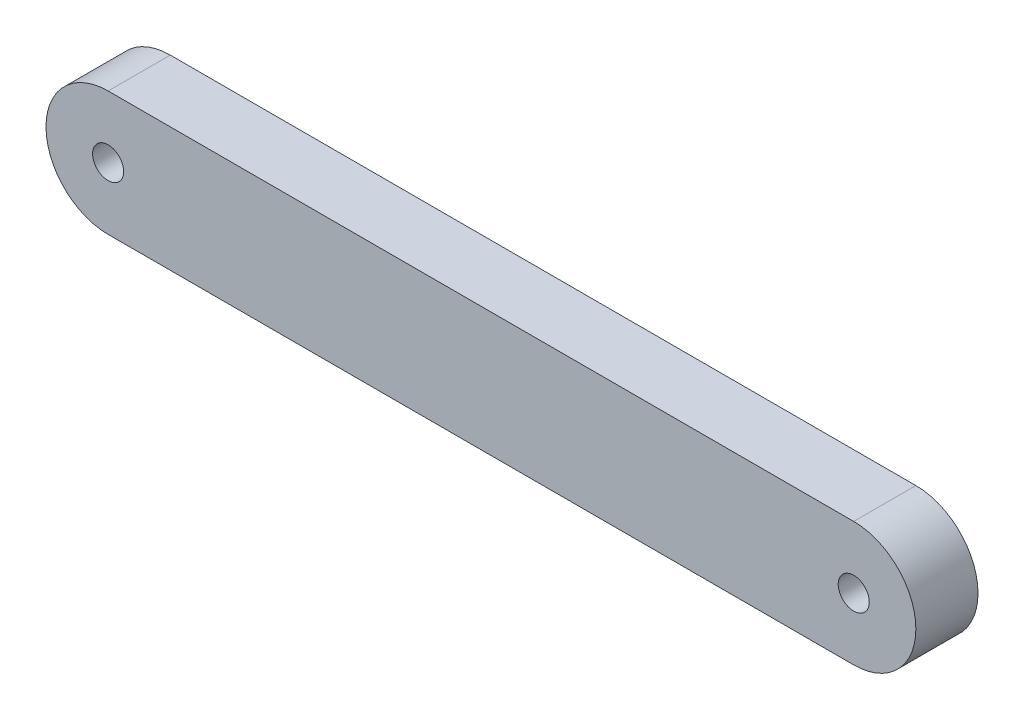
ISO-10303-21;
HEADER;
FILE_DESCRIPTION(('STEP AP214'),'2;1');
FILE_NAME('part.step','',(''),(''),'','','');
FILE_SCHEMA(('AUTOMOTIVE_DESIGN { 1 0 10303 214 1 1 1 1 }'));
ENDSEC;
DATA;
#1=APPLICATION_CONTEXT('core data for automotive mechanical design processes');
#2=APPLICATION_PROTOCOL_DEFINITION('international standard','automotive_design',2000,#1);
#3=PRODUCT_CONTEXT('',#1,'mechanical');
#4=PRODUCT('Part','Part','',(#3));
#5=PRODUCT_RELATED_PRODUCT_CATEGORY('part','',(#4));
#6=PRODUCT_DEFINITION_FORMATION('','',#4);
#7=PRODUCT_DEFINITION_CONTEXT('part definition',#1,'design');
#8=PRODUCT_DEFINITION('design','',#6,#7);
#9=PRODUCT_DEFINITION_SHAPE('','',#8);
#10=(LENGTH_UNIT() NAMED_UNIT(*) SI_UNIT(.MILLI.,.METRE.));
#11=(NAMED_UNIT(*) PLANE_ANGLE_UNIT() SI_UNIT($,.RADIAN.));
#12=(NAMED_UNIT(*) SI_UNIT($,.STERADIAN.) SOLID_ANGLE_UNIT());
#13=UNCERTAINTY_MEASURE_WITH_UNIT(LENGTH_MEASURE(1.E-05),#10,'distance_accuracy_value','');
#14=(GEOMETRIC_REPRESENTATION_CONTEXT(3) GLOBAL_UNCERTAINTY_ASSIGNED_CONTEXT((#13)) GLOBAL_UNIT_ASSIGNED_CONTEXT((#10,
#11,#12)) REPRESENTATION_CONTEXT('',''));
#15=CARTESIAN_POINT('',(0.,0.,0.));
#16=DIRECTION('',(0.,0.,1.));
#17=DIRECTION('',(1.,0.,0.));
#18=AXIS2_PLACEMENT_3D('',#15,#16,#17);
#19=CARTESIAN_POINT('',(0.,-6.35,6.35));
#20=DIRECTION('',(0.,1.,0.));
#21=DIRECTION('',(-1.,0.,0.));
#22=AXIS2_PLACEMENT_3D('',#19,#20,#21);
#23=PLANE('',#22);
#24=DIRECTION('',(1.,0.,0.));
#25=VECTOR('',#24,1.);
#26=CARTESIAN_POINT('',(0.,-6.35,0.));
#27=LINE('',#26,#25);
#28=CARTESIAN_POINT('',(0.,-6.35,0.));
#29=VERTEX_POINT('',#28);
#30=CARTESIAN_POINT('',(76.2,-6.34999999999999,0.));
#31=VERTEX_POINT('',#30);
#32=EDGE_CURVE('E104',#29,#31,#27,.T.);
#33=ORIENTED_EDGE('',*,*,#32,.T.);
#34=DIRECTION('',(0.,0.,-1.));
#35=VECTOR('',#34,1.);
#36=CARTESIAN_POINT('',(76.2,-6.34999999999999,6.35));
#37=LINE('',#36,#35);
#38=CARTESIAN_POINT('',(76.2,-6.34999999999999,6.35));
#39=VERTEX_POINT('',#38);
#40=EDGE_CURVE('E11',#39,#31,#37,.T.);
#41=ORIENTED_EDGE('',*,*,#40,.F.);
#42=DIRECTION('',(1.,0.,0.));
#43=VECTOR('',#42,1.);
#44=CARTESIAN_POINT('',(0.,-6.35,6.35));
#45=LINE('',#44,#43);
#46=CARTESIAN_POINT('',(0.,-6.35,6.35));
#47=VERTEX_POINT('',#46);
#48=EDGE_CURVE('E83',#47,#39,#45,.T.);
#49=ORIENTED_EDGE('',*,*,#48,.F.);
#50=DIRECTION('',(0.,0.,-1.));
#51=VECTOR('',#50,1.);
#52=CARTESIAN_POINT('',(0.,-6.35,6.35));
#53=LINE('',#52,#51);
#54=EDGE_CURVE('E103',#47,#29,#53,.T.);
#55=ORIENTED_EDGE('',*,*,#54,.T.);
#56=EDGE_LOOP('',(#33,#41,#49,#55));
#57=FACE_BOUND('',#56,.T.);
#58=ADVANCED_FACE('F35',(#57),#23,.F.);
#59=CARTESIAN_POINT('',(76.2,0.,6.35));
#60=DIRECTION('',(0.,0.,-1.));
#61=DIRECTION('',(-1.,0.,0.));
#62=AXIS2_PLACEMENT_3D('',#59,#60,#61);
#63=CYLINDRICAL_SURFACE('',#62,6.35);
#64=CARTESIAN_POINT('',(76.2,0.,0.));
#65=DIRECTION('',(0.,0.,1.));
#66=DIRECTION('',(1.,0.,0.));
#67=AXIS2_PLACEMENT_3D('',#64,#65,#66);
#68=CIRCLE('',#67,6.35);
#69=CARTESIAN_POINT('',(76.2,6.35,0.));
#70=VERTEX_POINT('',#69);
#71=EDGE_CURVE('E88',#31,#70,#68,.T.);
#72=ORIENTED_EDGE('',*,*,#71,.T.);
#73=DIRECTION('',(0.,0.,-1.));
#74=VECTOR('',#73,1.);
#75=CARTESIAN_POINT('',(76.2,6.35,6.35));
#76=LINE('',#75,#74);
#77=CARTESIAN_POINT('',(76.2,6.35,6.35));
#78=VERTEX_POINT('',#77);
#79=EDGE_CURVE('E43',#78,#70,#76,.T.);
#80=ORIENTED_EDGE('',*,*,#79,.F.);
#81=CARTESIAN_POINT('',(76.2,0.,6.35));
#82=DIRECTION('',(0.,0.,1.));
#83=DIRECTION('',(1.,0.,0.));
#84=AXIS2_PLACEMENT_3D('',#81,#82,#83);
#85=CIRCLE('',#84,6.35);
#86=EDGE_CURVE('E77',#39,#78,#85,.T.);
#87=ORIENTED_EDGE('',*,*,#86,.F.);
#88=ORIENTED_EDGE('',*,*,#40,.T.);
#89=EDGE_LOOP('',(#72,#80,#87,#88));
#90=FACE_BOUND('',#89,.T.);
#91=ADVANCED_FACE('F87',(#90),#63,.T.);
#92=CARTESIAN_POINT('',(0.,6.35,6.35));
#93=DIRECTION('',(0.,1.,0.));
#94=DIRECTION('',(-1.,0.,0.));
#95=AXIS2_PLACEMENT_3D('',#92,#93,#94);
#96=PLANE('',#95);
#97=DIRECTION('',(1.,0.,0.));
#98=VECTOR('',#97,1.);
#99=CARTESIAN_POINT('',(0.,6.35,0.));
#100=LINE('',#99,#98);
#101=CARTESIAN_POINT('',(0.,6.35,0.));
#102=VERTEX_POINT('',#101);
#103=EDGE_CURVE('E108',#102,#70,#100,.T.);
#104=ORIENTED_EDGE('',*,*,#103,.F.);
#105=DIRECTION('',(0.,0.,-1.));
#106=VECTOR('',#105,1.);
#107=CARTESIAN_POINT('',(0.,6.35,6.35));
#108=LINE('',#107,#106);
#109=CARTESIAN_POINT('',(0.,6.35,6.35));
#110=VERTEX_POINT('',#109);
#111=EDGE_CURVE('E67',#110,#102,#108,.T.);
#112=ORIENTED_EDGE('',*,*,#111,.F.);
#113=DIRECTION('',(1.,0.,0.));
#114=VECTOR('',#113,1.);
#115=CARTESIAN_POINT('',(0.,6.35,6.35));
#116=LINE('',#115,#114);
#117=EDGE_CURVE('E81',#110,#78,#116,.T.);
#118=ORIENTED_EDGE('',*,*,#117,.T.);
#119=ORIENTED_EDGE('',*,*,#79,.T.);
#120=EDGE_LOOP('',(#104,#112,#118,#119));
#121=FACE_BOUND('',#120,.T.);
#122=ADVANCED_FACE('F92',(#121),#96,.T.);
#123=CARTESIAN_POINT('',(0.,0.,6.35));
#124=DIRECTION('',(0.,0.,-1.));
#125=DIRECTION('',(-1.,0.,0.));
#126=AXIS2_PLACEMENT_3D('',#123,#124,#125);
#127=CYLINDRICAL_SURFACE('',#126,1.5875);
#128=CARTESIAN_POINT('',(0.,0.,6.35));
#129=DIRECTION('',(0.,0.,1.));
#130=DIRECTION('',(1.,0.,0.));
#131=AXIS2_PLACEMENT_3D('',#128,#129,#130);
#132=CIRCLE('',#131,1.5875);
#133=CARTESIAN_POINT('',(1.5875,0.,6.35));
#134=VERTEX_POINT('',#133);
#135=EDGE_CURVE('E94',#134,#134,#132,.T.);
#136=ORIENTED_EDGE('',*,*,#135,.T.);
#137=EDGE_LOOP('',(#136));
#138=FACE_BOUND('',#137,.T.);
#139=CARTESIAN_POINT('',(0.,0.,0.));
#140=DIRECTION('',(0.,0.,1.));
#141=DIRECTION('',(1.,0.,0.));
#142=AXIS2_PLACEMENT_3D('',#139,#140,#141);
#143=CIRCLE('',#142,1.5875);
#144=CARTESIAN_POINT('',(1.5875,0.,0.));
#145=VERTEX_POINT('',#144);
#146=EDGE_CURVE('E111',#145,#145,#143,.T.);
#147=ORIENTED_EDGE('',*,*,#146,.F.);
#148=EDGE_LOOP('',(#147));
#149=FACE_BOUND('',#148,.T.);
#150=ADVANCED_FACE('F139',(#138,#149),#127,.F.);
#151=CARTESIAN_POINT('',(0.,0.,6.35));
#152=DIRECTION('',(0.,0.,-1.));
#153=DIRECTION('',(-1.,0.,0.));
#154=AXIS2_PLACEMENT_3D('',#151,#152,#153);
#155=CYLINDRICAL_SURFACE('',#154,6.35);
#156=CARTESIAN_POINT('',(0.,0.,0.));
#157=DIRECTION('',(0.,0.,1.));
#158=DIRECTION('',(1.,0.,0.));
#159=AXIS2_PLACEMENT_3D('',#156,#157,#158);
#160=CIRCLE('',#159,6.35);
#161=EDGE_CURVE('E70',#102,#29,#160,.T.);
#162=ORIENTED_EDGE('',*,*,#161,.T.);
#163=ORIENTED_EDGE('',*,*,#54,.F.);
#164=CARTESIAN_POINT('',(0.,0.,6.35));
#165=DIRECTION('',(0.,0.,1.));
#166=DIRECTION('',(1.,0.,0.));
#167=AXIS2_PLACEMENT_3D('',#164,#165,#166);
#168=CIRCLE('',#167,6.35);
#169=EDGE_CURVE('E51',#110,#47,#168,.T.);
#170=ORIENTED_EDGE('',*,*,#169,.F.);
#171=ORIENTED_EDGE('',*,*,#111,.T.);
#172=EDGE_LOOP('',(#162,#163,#170,#171));
#173=FACE_BOUND('',#172,.T.);
#174=ADVANCED_FACE('F131',(#173),#155,.T.);
#175=CARTESIAN_POINT('',(76.2,0.,6.35));
#176=DIRECTION('',(0.,0.,-1.));
#177=DIRECTION('',(-1.,0.,0.));
#178=AXIS2_PLACEMENT_3D('',#175,#176,#177);
#179=CYLINDRICAL_SURFACE('',#178,1.5875);
#180=CARTESIAN_POINT('',(76.2,0.,6.35));
#181=DIRECTION('',(0.,0.,1.));
#182=DIRECTION('',(1.,0.,0.));
#183=AXIS2_PLACEMENT_3D('',#180,#181,#182);
#184=CIRCLE('',#183,1.5875);
#185=CARTESIAN_POINT('',(77.7875,0.,6.35));
#186=VERTEX_POINT('',#185);
#187=EDGE_CURVE('E100',#186,#186,#184,.T.);
#188=ORIENTED_EDGE('',*,*,#187,.T.);
#189=EDGE_LOOP('',(#188));
#190=FACE_BOUND('',#189,.T.);
#191=CARTESIAN_POINT('',(76.2,0.,0.));
#192=DIRECTION('',(0.,0.,1.));
#193=DIRECTION('',(1.,0.,0.));
#194=AXIS2_PLACEMENT_3D('',#191,#192,#193);
#195=CIRCLE('',#194,1.5875);
#196=CARTESIAN_POINT('',(77.7875,0.,0.));
#197=VERTEX_POINT('',#196);
#198=EDGE_CURVE('E114',#197,#197,#195,.T.);
#199=ORIENTED_EDGE('',*,*,#198,.F.);
#200=EDGE_LOOP('',(#199));
#201=FACE_BOUND('',#200,.T.);
#202=ADVANCED_FACE('F129',(#190,#201),#179,.F.);
#203=CARTESIAN_POINT('',(0.,0.,6.35));
#204=DIRECTION('',(0.,0.,1.));
#205=DIRECTION('',(1.,0.,0.));
#206=AXIS2_PLACEMENT_3D('',#203,#204,#205);
#207=PLANE('',#206);
#208=ORIENTED_EDGE('',*,*,#48,.T.);
#209=ORIENTED_EDGE('',*,*,#86,.T.);
#210=ORIENTED_EDGE('',*,*,#117,.F.);
#211=ORIENTED_EDGE('',*,*,#169,.T.);
#212=EDGE_LOOP('',(#208,#209,#210,#211));
#213=FACE_BOUND('',#212,.T.);
#214=ORIENTED_EDGE('',*,*,#135,.F.);
#215=EDGE_LOOP('',(#214));
#216=FACE_BOUND('',#215,.T.);
#217=ORIENTED_EDGE('',*,*,#187,.F.);
#218=EDGE_LOOP('',(#217));
#219=FACE_BOUND('',#218,.T.);
#220=ADVANCED_FACE('F78',(#213,#216,#219),#207,.T.);
#221=CARTESIAN_POINT('',(0.,0.,0.));
#222=DIRECTION('',(0.,0.,1.));
#223=DIRECTION('',(1.,0.,0.));
#224=AXIS2_PLACEMENT_3D('',#221,#222,#223);
#225=PLANE('',#224);
#226=ORIENTED_EDGE('',*,*,#32,.F.);
#227=ORIENTED_EDGE('',*,*,#161,.F.);
#228=ORIENTED_EDGE('',*,*,#103,.T.);
#229=ORIENTED_EDGE('',*,*,#71,.F.);
#230=EDGE_LOOP('',(#226,#227,#228,#229));
#231=FACE_BOUND('',#230,.T.);
#232=ORIENTED_EDGE('',*,*,#146,.T.);
#233=EDGE_LOOP('',(#232));
#234=FACE_BOUND('',#233,.T.);
#235=ORIENTED_EDGE('',*,*,#198,.T.);
#236=EDGE_LOOP('',(#235));
#237=FACE_BOUND('',#236,.T.);
#238=ADVANCED_FACE('F121',(#231,#234,#237),#225,.F.);
#239=CLOSED_SHELL('',(#58,#91,#122,#150,#174,#202,#220,#238));
#240=MANIFOLD_SOLID_BREP('B2',#239);
#241=ADVANCED_BREP_SHAPE_REPRESENTATION('',(#18,#240),#14);
#242=SHAPE_DEFINITION_REPRESENTATION(#9,#241);
ENDSEC;
END-ISO-10303-21;
